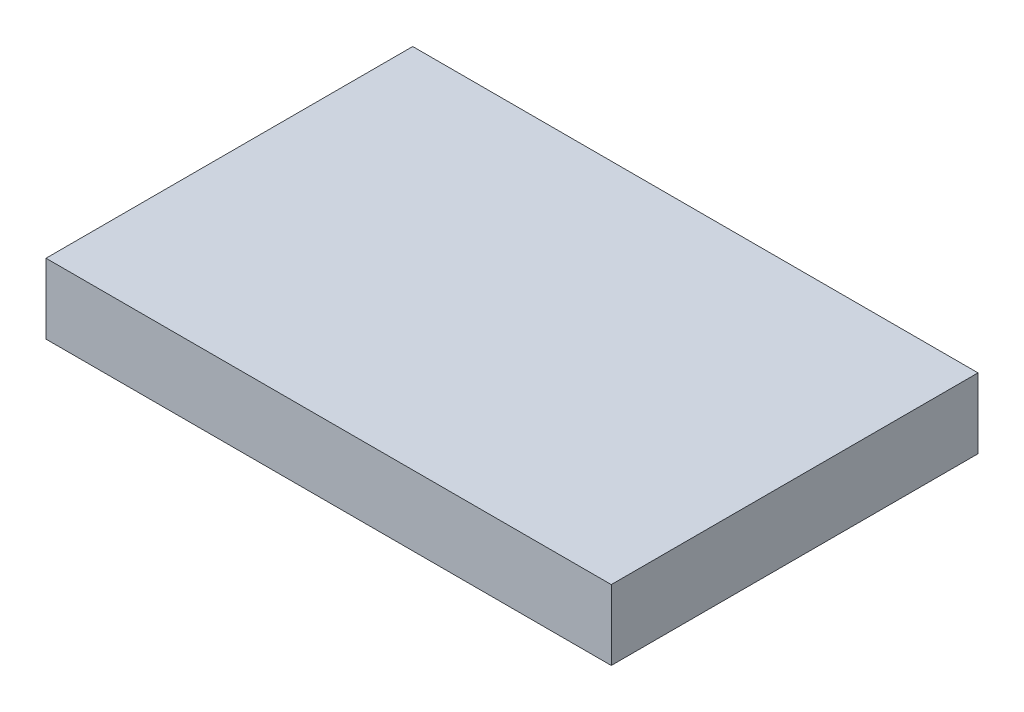
ISO-10303-21;
HEADER;
FILE_DESCRIPTION(('STEP AP214'),'2;1');
FILE_NAME('part.step','',(''),(''),'','','');
FILE_SCHEMA(('AUTOMOTIVE_DESIGN { 1 0 10303 214 1 1 1 1 }'));
ENDSEC;
DATA;
#1=APPLICATION_CONTEXT('core data for automotive mechanical design processes');
#2=APPLICATION_PROTOCOL_DEFINITION('international standard','automotive_design',2000,#1);
#3=PRODUCT_CONTEXT('',#1,'mechanical');
#4=PRODUCT('Part','Part','',(#3));
#5=PRODUCT_RELATED_PRODUCT_CATEGORY('part','',(#4));
#6=PRODUCT_DEFINITION_FORMATION('','',#4);
#7=PRODUCT_DEFINITION_CONTEXT('part definition',#1,'design');
#8=PRODUCT_DEFINITION('design','',#6,#7);
#9=PRODUCT_DEFINITION_SHAPE('','',#8);
#10=(LENGTH_UNIT() NAMED_UNIT(*) SI_UNIT(.MILLI.,.METRE.));
#11=(NAMED_UNIT(*) PLANE_ANGLE_UNIT() SI_UNIT($,.RADIAN.));
#12=(NAMED_UNIT(*) SI_UNIT($,.STERADIAN.) SOLID_ANGLE_UNIT());
#13=UNCERTAINTY_MEASURE_WITH_UNIT(LENGTH_MEASURE(1.E-05),#10,'distance_accuracy_value','');
#14=(GEOMETRIC_REPRESENTATION_CONTEXT(3) GLOBAL_UNCERTAINTY_ASSIGNED_CONTEXT((#13)) GLOBAL_UNIT_ASSIGNED_CONTEXT((#10,
#11,#12)) REPRESENTATION_CONTEXT('',''));
#15=CARTESIAN_POINT('',(0.,0.,0.));
#16=DIRECTION('',(0.,0.,1.));
#17=DIRECTION('',(1.,0.,0.));
#18=AXIS2_PLACEMENT_3D('',#15,#16,#17);
#19=CARTESIAN_POINT('',(16.7,76.2,-343.257716773723));
#20=DIRECTION('',(1.,0.,0.));
#21=DIRECTION('',(0.,0.,-1.));
#22=AXIS2_PLACEMENT_3D('',#19,#20,#21);
#23=PLANE('',#22);
#24=DIRECTION('',(0.,0.,1.));
#25=VECTOR('',#24,1.);
#26=CARTESIAN_POINT('',(16.7,0.,-343.257716773723));
#27=LINE('',#26,#25);
#28=CARTESIAN_POINT('',(16.7,0.,-343.257716773723));
#29=VERTEX_POINT('',#28);
#30=CARTESIAN_POINT('',(16.7,0.,55.5222832262772));
#31=VERTEX_POINT('',#30);
#32=EDGE_CURVE('E115',#29,#31,#27,.T.);
#33=ORIENTED_EDGE('',*,*,#32,.T.);
#34=DIRECTION('',(0.,-1.,0.));
#35=VECTOR('',#34,1.);
#36=CARTESIAN_POINT('',(16.7,76.2,55.5222832262772));
#37=LINE('',#36,#35);
#38=CARTESIAN_POINT('',(16.7,76.2,55.5222832262772));
#39=VERTEX_POINT('',#38);
#40=EDGE_CURVE('E11',#39,#31,#37,.T.);
#41=ORIENTED_EDGE('',*,*,#40,.F.);
#42=DIRECTION('',(0.,0.,1.));
#43=VECTOR('',#42,1.);
#44=CARTESIAN_POINT('',(16.7,76.2,-343.257716773723));
#45=LINE('',#44,#43);
#46=CARTESIAN_POINT('',(16.7,76.2,-343.257716773723));
#47=VERTEX_POINT('',#46);
#48=EDGE_CURVE('E99',#47,#39,#45,.T.);
#49=ORIENTED_EDGE('',*,*,#48,.F.);
#50=DIRECTION('',(0.,-1.,0.));
#51=VECTOR('',#50,1.);
#52=CARTESIAN_POINT('',(16.7,76.2,-343.257716773723));
#53=LINE('',#52,#51);
#54=EDGE_CURVE('E111',#47,#29,#53,.T.);
#55=ORIENTED_EDGE('',*,*,#54,.T.);
#56=EDGE_LOOP('',(#33,#41,#49,#55));
#57=FACE_BOUND('',#56,.T.);
#58=ADVANCED_FACE('F47',(#57),#23,.F.);
#59=CARTESIAN_POINT('',(16.7,76.2,55.5222832262772));
#60=DIRECTION('',(0.,0.,-1.));
#61=DIRECTION('',(-1.,0.,0.));
#62=AXIS2_PLACEMENT_3D('',#59,#60,#61);
#63=PLANE('',#62);
#64=DIRECTION('',(1.,0.,0.));
#65=VECTOR('',#64,1.);
#66=CARTESIAN_POINT('',(16.7,0.,55.5222832262772));
#67=LINE('',#66,#65);
#68=CARTESIAN_POINT('',(631.38,0.,55.5222832262772));
#69=VERTEX_POINT('',#68);
#70=EDGE_CURVE('E104',#31,#69,#67,.T.);
#71=ORIENTED_EDGE('',*,*,#70,.T.);
#72=DIRECTION('',(0.,-1.,0.));
#73=VECTOR('',#72,1.);
#74=CARTESIAN_POINT('',(631.38,76.2,55.5222832262772));
#75=LINE('',#74,#73);
#76=CARTESIAN_POINT('',(631.38,76.2,55.5222832262772));
#77=VERTEX_POINT('',#76);
#78=EDGE_CURVE('E56',#77,#69,#75,.T.);
#79=ORIENTED_EDGE('',*,*,#78,.F.);
#80=DIRECTION('',(1.,0.,0.));
#81=VECTOR('',#80,1.);
#82=CARTESIAN_POINT('',(16.7,76.2,55.5222832262772));
#83=LINE('',#82,#81);
#84=EDGE_CURVE('E94',#39,#77,#83,.T.);
#85=ORIENTED_EDGE('',*,*,#84,.F.);
#86=ORIENTED_EDGE('',*,*,#40,.T.);
#87=EDGE_LOOP('',(#71,#79,#85,#86));
#88=FACE_BOUND('',#87,.T.);
#89=ADVANCED_FACE('F103',(#88),#63,.F.);
#90=CARTESIAN_POINT('',(631.38,76.2,-343.257716773723));
#91=DIRECTION('',(-1.,0.,0.));
#92=DIRECTION('',(0.,0.,1.));
#93=AXIS2_PLACEMENT_3D('',#90,#91,#92);
#94=PLANE('',#93);
#95=DIRECTION('',(0.,0.,-1.));
#96=VECTOR('',#95,1.);
#97=CARTESIAN_POINT('',(631.38,0.,-343.257716773723));
#98=LINE('',#97,#96);
#99=CARTESIAN_POINT('',(631.38,0.,-343.257716773723));
#100=VERTEX_POINT('',#99);
#101=EDGE_CURVE('E81',#69,#100,#98,.T.);
#102=ORIENTED_EDGE('',*,*,#101,.T.);
#103=DIRECTION('',(0.,-1.,0.));
#104=VECTOR('',#103,1.);
#105=CARTESIAN_POINT('',(631.38,76.2,-343.257716773723));
#106=LINE('',#105,#104);
#107=CARTESIAN_POINT('',(631.38,76.2,-343.257716773723));
#108=VERTEX_POINT('',#107);
#109=EDGE_CURVE('E106',#108,#100,#106,.T.);
#110=ORIENTED_EDGE('',*,*,#109,.F.);
#111=DIRECTION('',(0.,0.,-1.));
#112=VECTOR('',#111,1.);
#113=CARTESIAN_POINT('',(631.38,76.2,-343.257716773723));
#114=LINE('',#113,#112);
#115=EDGE_CURVE('E97',#77,#108,#114,.T.);
#116=ORIENTED_EDGE('',*,*,#115,.F.);
#117=ORIENTED_EDGE('',*,*,#78,.T.);
#118=EDGE_LOOP('',(#102,#110,#116,#117));
#119=FACE_BOUND('',#118,.T.);
#120=ADVANCED_FACE('F107',(#119),#94,.F.);
#121=CARTESIAN_POINT('',(16.7,76.2,-343.257716773723));
#122=DIRECTION('',(0.,0.,1.));
#123=DIRECTION('',(1.,0.,0.));
#124=AXIS2_PLACEMENT_3D('',#121,#122,#123);
#125=PLANE('',#124);
#126=DIRECTION('',(-1.,0.,0.));
#127=VECTOR('',#126,1.);
#128=CARTESIAN_POINT('',(16.7,0.,-343.257716773723));
#129=LINE('',#128,#127);
#130=EDGE_CURVE('E87',#100,#29,#129,.T.);
#131=ORIENTED_EDGE('',*,*,#130,.T.);
#132=ORIENTED_EDGE('',*,*,#54,.F.);
#133=DIRECTION('',(-1.,0.,0.));
#134=VECTOR('',#133,1.);
#135=CARTESIAN_POINT('',(16.7,76.2,-343.257716773723));
#136=LINE('',#135,#134);
#137=EDGE_CURVE('E64',#108,#47,#136,.T.);
#138=ORIENTED_EDGE('',*,*,#137,.F.);
#139=ORIENTED_EDGE('',*,*,#109,.T.);
#140=EDGE_LOOP('',(#131,#132,#138,#139));
#141=FACE_BOUND('',#140,.T.);
#142=ADVANCED_FACE('F128',(#141),#125,.F.);
#143=CARTESIAN_POINT('',(0.,76.2,0.));
#144=DIRECTION('',(0.,1.,0.));
#145=DIRECTION('',(0.,0.,1.));
#146=AXIS2_PLACEMENT_3D('',#143,#144,#145);
#147=PLANE('',#146);
#148=ORIENTED_EDGE('',*,*,#48,.T.);
#149=ORIENTED_EDGE('',*,*,#84,.T.);
#150=ORIENTED_EDGE('',*,*,#115,.T.);
#151=ORIENTED_EDGE('',*,*,#137,.T.);
#152=EDGE_LOOP('',(#148,#149,#150,#151));
#153=FACE_BOUND('',#152,.T.);
#154=ADVANCED_FACE('F95',(#153),#147,.T.);
#155=CARTESIAN_POINT('',(0.,0.,0.));
#156=DIRECTION('',(0.,1.,0.));
#157=DIRECTION('',(0.,0.,1.));
#158=AXIS2_PLACEMENT_3D('',#155,#156,#157);
#159=PLANE('',#158);
#160=ORIENTED_EDGE('',*,*,#32,.F.);
#161=ORIENTED_EDGE('',*,*,#130,.F.);
#162=ORIENTED_EDGE('',*,*,#101,.F.);
#163=ORIENTED_EDGE('',*,*,#70,.F.);
#164=EDGE_LOOP('',(#160,#161,#162,#163));
#165=FACE_BOUND('',#164,.T.);
#166=ADVANCED_FACE('F131',(#165),#159,.F.);
#167=CLOSED_SHELL('',(#58,#89,#120,#142,#154,#166));
#168=MANIFOLD_SOLID_BREP('B2',#167);
#169=ADVANCED_BREP_SHAPE_REPRESENTATION('',(#18,#168),#14);
#170=SHAPE_DEFINITION_REPRESENTATION(#9,#169);
ENDSEC;
END-ISO-10303-21;
